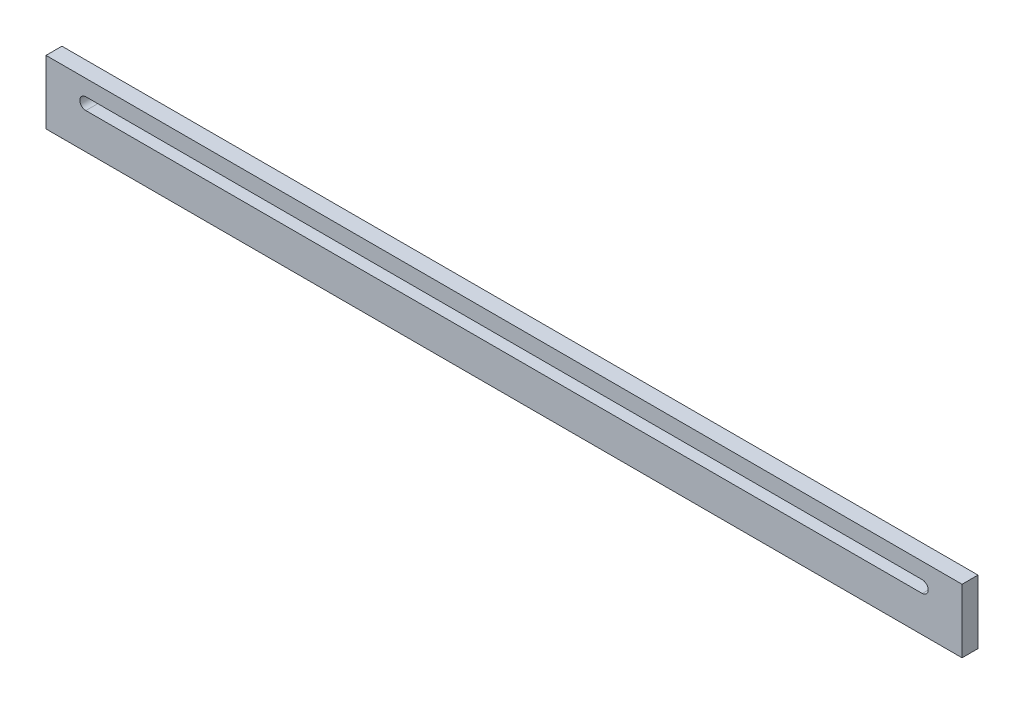
ISO-10303-21;
HEADER;
FILE_DESCRIPTION(('STEP AP214'),'2;1');
FILE_NAME('part.step','',(''),(''),'','','');
FILE_SCHEMA(('AUTOMOTIVE_DESIGN { 1 0 10303 214 1 1 1 1 }'));
ENDSEC;
DATA;
#1=APPLICATION_CONTEXT('core data for automotive mechanical design processes');
#2=APPLICATION_PROTOCOL_DEFINITION('international standard','automotive_design',2000,#1);
#3=PRODUCT_CONTEXT('',#1,'mechanical');
#4=PRODUCT('Part','Part','',(#3));
#5=PRODUCT_RELATED_PRODUCT_CATEGORY('part','',(#4));
#6=PRODUCT_DEFINITION_FORMATION('','',#4);
#7=PRODUCT_DEFINITION_CONTEXT('part definition',#1,'design');
#8=PRODUCT_DEFINITION('design','',#6,#7);
#9=PRODUCT_DEFINITION_SHAPE('','',#8);
#10=(LENGTH_UNIT() NAMED_UNIT(*) SI_UNIT(.MILLI.,.METRE.));
#11=(NAMED_UNIT(*) PLANE_ANGLE_UNIT() SI_UNIT($,.RADIAN.));
#12=(NAMED_UNIT(*) SI_UNIT($,.STERADIAN.) SOLID_ANGLE_UNIT());
#13=UNCERTAINTY_MEASURE_WITH_UNIT(LENGTH_MEASURE(1.E-05),#10,'distance_accuracy_value','');
#14=(GEOMETRIC_REPRESENTATION_CONTEXT(3) GLOBAL_UNCERTAINTY_ASSIGNED_CONTEXT((#13)) GLOBAL_UNIT_ASSIGNED_CONTEXT((#10,
#11,#12)) REPRESENTATION_CONTEXT('',''));
#15=CARTESIAN_POINT('',(0.,0.,0.));
#16=DIRECTION('',(0.,0.,1.));
#17=DIRECTION('',(1.,0.,0.));
#18=AXIS2_PLACEMENT_3D('',#15,#16,#17);
#19=CARTESIAN_POINT('',(0.,0.,4.));
#20=DIRECTION('',(0.,0.,1.));
#21=DIRECTION('',(1.,0.,0.));
#22=AXIS2_PLACEMENT_3D('',#19,#20,#21);
#23=PLANE('',#22);
#24=DIRECTION('',(0.,-1.,0.));
#25=VECTOR('',#24,1.);
#26=CARTESIAN_POINT('',(0.,0.,4.));
#27=LINE('',#26,#25);
#28=CARTESIAN_POINT('',(0.,0.,4.));
#29=VERTEX_POINT('',#28);
#30=CARTESIAN_POINT('',(0.,-16.,4.));
#31=VERTEX_POINT('',#30);
#32=EDGE_CURVE('E138',#29,#31,#27,.T.);
#33=ORIENTED_EDGE('',*,*,#32,.T.);
#34=DIRECTION('',(1.,0.,0.));
#35=VECTOR('',#34,1.);
#36=CARTESIAN_POINT('',(0.,-16.,4.));
#37=LINE('',#36,#35);
#38=CARTESIAN_POINT('',(230.,-16.,4.));
#39=VERTEX_POINT('',#38);
#40=EDGE_CURVE('E141',#31,#39,#37,.T.);
#41=ORIENTED_EDGE('',*,*,#40,.T.);
#42=DIRECTION('',(0.,1.,0.));
#43=VECTOR('',#42,1.);
#44=CARTESIAN_POINT('',(230.,0.,4.));
#45=LINE('',#44,#43);
#46=CARTESIAN_POINT('',(230.,0.,4.));
#47=VERTEX_POINT('',#46);
#48=EDGE_CURVE('E144',#39,#47,#45,.T.);
#49=ORIENTED_EDGE('',*,*,#48,.T.);
#50=DIRECTION('',(-1.,0.,0.));
#51=VECTOR('',#50,1.);
#52=CARTESIAN_POINT('',(0.,0.,4.));
#53=LINE('',#52,#51);
#54=EDGE_CURVE('E146',#47,#29,#53,.T.);
#55=ORIENTED_EDGE('',*,*,#54,.T.);
#56=EDGE_LOOP('',(#33,#41,#49,#55));
#57=FACE_BOUND('',#56,.T.);
#58=DIRECTION('',(1.,0.,0.));
#59=VECTOR('',#58,1.);
#60=CARTESIAN_POINT('',(10.,-7.00000000000008,4.));
#61=LINE('',#60,#59);
#62=CARTESIAN_POINT('',(10.,-7.00000000000008,4.));
#63=VERTEX_POINT('',#62);
#64=CARTESIAN_POINT('',(220.,-7.00000000000004,4.));
#65=VERTEX_POINT('',#64);
#66=EDGE_CURVE('E110',#63,#65,#61,.T.);
#67=ORIENTED_EDGE('',*,*,#66,.F.);
#68=CARTESIAN_POINT('',(10.,-5.50000000000004,4.));
#69=DIRECTION('',(0.,0.,1.));
#70=DIRECTION('',(1.,0.,0.));
#71=AXIS2_PLACEMENT_3D('',#68,#69,#70);
#72=CIRCLE('',#71,1.50000000000004);
#73=CARTESIAN_POINT('',(10.,-4.,4.));
#74=VERTEX_POINT('',#73);
#75=EDGE_CURVE('E102',#74,#63,#72,.T.);
#76=ORIENTED_EDGE('',*,*,#75,.F.);
#77=DIRECTION('',(-1.,0.,0.));
#78=VECTOR('',#77,1.);
#79=CARTESIAN_POINT('',(10.,-4.,4.));
#80=LINE('',#79,#78);
#81=CARTESIAN_POINT('',(220.,-4.00000000000004,4.));
#82=VERTEX_POINT('',#81);
#83=EDGE_CURVE('E124',#82,#74,#80,.T.);
#84=ORIENTED_EDGE('',*,*,#83,.F.);
#85=CARTESIAN_POINT('',(220.,-5.50000000000004,4.));
#86=DIRECTION('',(0.,0.,1.));
#87=DIRECTION('',(1.,0.,0.));
#88=AXIS2_PLACEMENT_3D('',#85,#86,#87);
#89=CIRCLE('',#88,1.5);
#90=EDGE_CURVE('E122',#65,#82,#89,.T.);
#91=ORIENTED_EDGE('',*,*,#90,.F.);
#92=EDGE_LOOP('',(#67,#76,#84,#91));
#93=FACE_BOUND('',#92,.T.);
#94=ADVANCED_FACE('F37',(#57,#93),#23,.T.);
#95=CARTESIAN_POINT('',(0.,0.,0.));
#96=DIRECTION('',(0.,0.,1.));
#97=DIRECTION('',(1.,0.,0.));
#98=AXIS2_PLACEMENT_3D('',#95,#96,#97);
#99=PLANE('',#98);
#100=DIRECTION('',(0.,-1.,0.));
#101=VECTOR('',#100,1.);
#102=CARTESIAN_POINT('',(0.,0.,0.));
#103=LINE('',#102,#101);
#104=CARTESIAN_POINT('',(0.,0.,0.));
#105=VERTEX_POINT('',#104);
#106=CARTESIAN_POINT('',(0.,-16.,0.));
#107=VERTEX_POINT('',#106);
#108=EDGE_CURVE('E118',#105,#107,#103,.T.);
#109=ORIENTED_EDGE('',*,*,#108,.F.);
#110=DIRECTION('',(-1.,0.,0.));
#111=VECTOR('',#110,1.);
#112=CARTESIAN_POINT('',(0.,0.,0.));
#113=LINE('',#112,#111);
#114=CARTESIAN_POINT('',(230.,0.,0.));
#115=VERTEX_POINT('',#114);
#116=EDGE_CURVE('E142',#115,#105,#113,.T.);
#117=ORIENTED_EDGE('',*,*,#116,.F.);
#118=DIRECTION('',(0.,1.,0.));
#119=VECTOR('',#118,1.);
#120=CARTESIAN_POINT('',(230.,0.,0.));
#121=LINE('',#120,#119);
#122=CARTESIAN_POINT('',(230.,-16.,0.));
#123=VERTEX_POINT('',#122);
#124=EDGE_CURVE('E153',#123,#115,#121,.T.);
#125=ORIENTED_EDGE('',*,*,#124,.F.);
#126=DIRECTION('',(1.,0.,0.));
#127=VECTOR('',#126,1.);
#128=CARTESIAN_POINT('',(0.,-16.,0.));
#129=LINE('',#128,#127);
#130=EDGE_CURVE('E151',#107,#123,#129,.T.);
#131=ORIENTED_EDGE('',*,*,#130,.F.);
#132=EDGE_LOOP('',(#109,#117,#125,#131));
#133=FACE_BOUND('',#132,.T.);
#134=CARTESIAN_POINT('',(10.,-5.50000000000004,0.));
#135=DIRECTION('',(0.,0.,1.));
#136=DIRECTION('',(1.,0.,0.));
#137=AXIS2_PLACEMENT_3D('',#134,#135,#136);
#138=CIRCLE('',#137,1.50000000000004);
#139=CARTESIAN_POINT('',(10.,-4.,0.));
#140=VERTEX_POINT('',#139);
#141=CARTESIAN_POINT('',(10.,-7.00000000000008,0.));
#142=VERTEX_POINT('',#141);
#143=EDGE_CURVE('E60',#140,#142,#138,.T.);
#144=ORIENTED_EDGE('',*,*,#143,.T.);
#145=DIRECTION('',(1.,0.,0.));
#146=VECTOR('',#145,1.);
#147=CARTESIAN_POINT('',(10.,-7.00000000000008,0.));
#148=LINE('',#147,#146);
#149=CARTESIAN_POINT('',(220.,-7.00000000000004,0.));
#150=VERTEX_POINT('',#149);
#151=EDGE_CURVE('E117',#142,#150,#148,.T.);
#152=ORIENTED_EDGE('',*,*,#151,.T.);
#153=CARTESIAN_POINT('',(220.,-5.50000000000004,0.));
#154=DIRECTION('',(0.,0.,1.));
#155=DIRECTION('',(1.,0.,0.));
#156=AXIS2_PLACEMENT_3D('',#153,#154,#155);
#157=CIRCLE('',#156,1.5);
#158=CARTESIAN_POINT('',(220.,-4.00000000000004,0.));
#159=VERTEX_POINT('',#158);
#160=EDGE_CURVE('E130',#150,#159,#157,.T.);
#161=ORIENTED_EDGE('',*,*,#160,.T.);
#162=DIRECTION('',(-1.,0.,0.));
#163=VECTOR('',#162,1.);
#164=CARTESIAN_POINT('',(10.,-4.,0.));
#165=LINE('',#164,#163);
#166=EDGE_CURVE('E111',#159,#140,#165,.T.);
#167=ORIENTED_EDGE('',*,*,#166,.T.);
#168=EDGE_LOOP('',(#144,#152,#161,#167));
#169=FACE_BOUND('',#168,.T.);
#170=ADVANCED_FACE('F171',(#133,#169),#99,.F.);
#171=CARTESIAN_POINT('',(0.,0.,4.));
#172=DIRECTION('',(1.,0.,0.));
#173=DIRECTION('',(0.,1.,0.));
#174=AXIS2_PLACEMENT_3D('',#171,#172,#173);
#175=PLANE('',#174);
#176=ORIENTED_EDGE('',*,*,#108,.T.);
#177=DIRECTION('',(0.,0.,-1.));
#178=VECTOR('',#177,1.);
#179=CARTESIAN_POINT('',(0.,-16.,4.));
#180=LINE('',#179,#178);
#181=EDGE_CURVE('E11',#31,#107,#180,.T.);
#182=ORIENTED_EDGE('',*,*,#181,.F.);
#183=ORIENTED_EDGE('',*,*,#32,.F.);
#184=DIRECTION('',(0.,0.,-1.));
#185=VECTOR('',#184,1.);
#186=CARTESIAN_POINT('',(0.,0.,4.));
#187=LINE('',#186,#185);
#188=EDGE_CURVE('E148',#29,#105,#187,.T.);
#189=ORIENTED_EDGE('',*,*,#188,.T.);
#190=EDGE_LOOP('',(#176,#182,#183,#189));
#191=FACE_BOUND('',#190,.T.);
#192=ADVANCED_FACE('F39',(#191),#175,.F.);
#193=CARTESIAN_POINT('',(0.,-16.,4.));
#194=DIRECTION('',(0.,1.,0.));
#195=DIRECTION('',(-1.,0.,0.));
#196=AXIS2_PLACEMENT_3D('',#193,#194,#195);
#197=PLANE('',#196);
#198=ORIENTED_EDGE('',*,*,#130,.T.);
#199=DIRECTION('',(0.,0.,-1.));
#200=VECTOR('',#199,1.);
#201=CARTESIAN_POINT('',(230.,-16.,4.));
#202=LINE('',#201,#200);
#203=EDGE_CURVE('E45',#39,#123,#202,.T.);
#204=ORIENTED_EDGE('',*,*,#203,.F.);
#205=ORIENTED_EDGE('',*,*,#40,.F.);
#206=ORIENTED_EDGE('',*,*,#181,.T.);
#207=EDGE_LOOP('',(#198,#204,#205,#206));
#208=FACE_BOUND('',#207,.T.);
#209=ADVANCED_FACE('F181',(#208),#197,.F.);
#210=CARTESIAN_POINT('',(230.,0.,4.));
#211=DIRECTION('',(-1.,0.,0.));
#212=DIRECTION('',(0.,0.,1.));
#213=AXIS2_PLACEMENT_3D('',#210,#211,#212);
#214=PLANE('',#213);
#215=ORIENTED_EDGE('',*,*,#124,.T.);
#216=DIRECTION('',(0.,0.,-1.));
#217=VECTOR('',#216,1.);
#218=CARTESIAN_POINT('',(230.,0.,4.));
#219=LINE('',#218,#217);
#220=EDGE_CURVE('E158',#47,#115,#219,.T.);
#221=ORIENTED_EDGE('',*,*,#220,.F.);
#222=ORIENTED_EDGE('',*,*,#48,.F.);
#223=ORIENTED_EDGE('',*,*,#203,.T.);
#224=EDGE_LOOP('',(#215,#221,#222,#223));
#225=FACE_BOUND('',#224,.T.);
#226=ADVANCED_FACE('F165',(#225),#214,.F.);
#227=CARTESIAN_POINT('',(0.,0.,4.));
#228=DIRECTION('',(0.,-1.,0.));
#229=DIRECTION('',(1.,0.,0.));
#230=AXIS2_PLACEMENT_3D('',#227,#228,#229);
#231=PLANE('',#230);
#232=ORIENTED_EDGE('',*,*,#116,.T.);
#233=ORIENTED_EDGE('',*,*,#188,.F.);
#234=ORIENTED_EDGE('',*,*,#54,.F.);
#235=ORIENTED_EDGE('',*,*,#220,.T.);
#236=EDGE_LOOP('',(#232,#233,#234,#235));
#237=FACE_BOUND('',#236,.T.);
#238=ADVANCED_FACE('F175',(#237),#231,.F.);
#239=CARTESIAN_POINT('',(10.,-5.50000000000004,4.));
#240=DIRECTION('',(0.,0.,-1.));
#241=DIRECTION('',(-1.,0.,0.));
#242=AXIS2_PLACEMENT_3D('',#239,#240,#241);
#243=CYLINDRICAL_SURFACE('',#242,1.50000000000004);
#244=ORIENTED_EDGE('',*,*,#143,.F.);
#245=DIRECTION('',(0.,0.,-1.));
#246=VECTOR('',#245,1.);
#247=CARTESIAN_POINT('',(10.,-4.,4.));
#248=LINE('',#247,#246);
#249=EDGE_CURVE('E106',#74,#140,#248,.T.);
#250=ORIENTED_EDGE('',*,*,#249,.F.);
#251=ORIENTED_EDGE('',*,*,#75,.T.);
#252=DIRECTION('',(0.,0.,-1.));
#253=VECTOR('',#252,1.);
#254=CARTESIAN_POINT('',(10.,-7.00000000000008,4.));
#255=LINE('',#254,#253);
#256=EDGE_CURVE('E105',#63,#142,#255,.T.);
#257=ORIENTED_EDGE('',*,*,#256,.T.);
#258=EDGE_LOOP('',(#244,#250,#251,#257));
#259=FACE_BOUND('',#258,.T.);
#260=ADVANCED_FACE('F104',(#259),#243,.F.);
#261=CARTESIAN_POINT('',(10.,-7.00000000000008,4.));
#262=DIRECTION('',(0.,1.,0.));
#263=DIRECTION('',(-1.,0.,0.));
#264=AXIS2_PLACEMENT_3D('',#261,#262,#263);
#265=PLANE('',#264);
#266=ORIENTED_EDGE('',*,*,#151,.F.);
#267=ORIENTED_EDGE('',*,*,#256,.F.);
#268=ORIENTED_EDGE('',*,*,#66,.T.);
#269=DIRECTION('',(0.,0.,-1.));
#270=VECTOR('',#269,1.);
#271=CARTESIAN_POINT('',(220.,-7.00000000000004,4.));
#272=LINE('',#271,#270);
#273=EDGE_CURVE('E119',#65,#150,#272,.T.);
#274=ORIENTED_EDGE('',*,*,#273,.T.);
#275=EDGE_LOOP('',(#266,#267,#268,#274));
#276=FACE_BOUND('',#275,.T.);
#277=ADVANCED_FACE('F114',(#276),#265,.T.);
#278=CARTESIAN_POINT('',(220.,-5.50000000000004,4.));
#279=DIRECTION('',(0.,0.,-1.));
#280=DIRECTION('',(-1.,0.,0.));
#281=AXIS2_PLACEMENT_3D('',#278,#279,#280);
#282=CYLINDRICAL_SURFACE('',#281,1.5);
#283=ORIENTED_EDGE('',*,*,#160,.F.);
#284=ORIENTED_EDGE('',*,*,#273,.F.);
#285=ORIENTED_EDGE('',*,*,#90,.T.);
#286=DIRECTION('',(0.,0.,-1.));
#287=VECTOR('',#286,1.);
#288=CARTESIAN_POINT('',(220.,-4.00000000000004,4.));
#289=LINE('',#288,#287);
#290=EDGE_CURVE('E52',#82,#159,#289,.T.);
#291=ORIENTED_EDGE('',*,*,#290,.T.);
#292=EDGE_LOOP('',(#283,#284,#285,#291));
#293=FACE_BOUND('',#292,.T.);
#294=ADVANCED_FACE('F204',(#293),#282,.F.);
#295=CARTESIAN_POINT('',(10.,-4.,4.));
#296=DIRECTION('',(0.,-1.,0.));
#297=DIRECTION('',(1.,0.,0.));
#298=AXIS2_PLACEMENT_3D('',#295,#296,#297);
#299=PLANE('',#298);
#300=ORIENTED_EDGE('',*,*,#166,.F.);
#301=ORIENTED_EDGE('',*,*,#290,.F.);
#302=ORIENTED_EDGE('',*,*,#83,.T.);
#303=ORIENTED_EDGE('',*,*,#249,.T.);
#304=EDGE_LOOP('',(#300,#301,#302,#303));
#305=FACE_BOUND('',#304,.T.);
#306=ADVANCED_FACE('F208',(#305),#299,.T.);
#307=CLOSED_SHELL('',(#94,#170,#192,#209,#226,#238,#260,#277,#294,#306));
#308=MANIFOLD_SOLID_BREP('B2',#307);
#309=ADVANCED_BREP_SHAPE_REPRESENTATION('',(#18,#308),#14);
#310=SHAPE_DEFINITION_REPRESENTATION(#9,#309);
ENDSEC;
END-ISO-10303-21;
